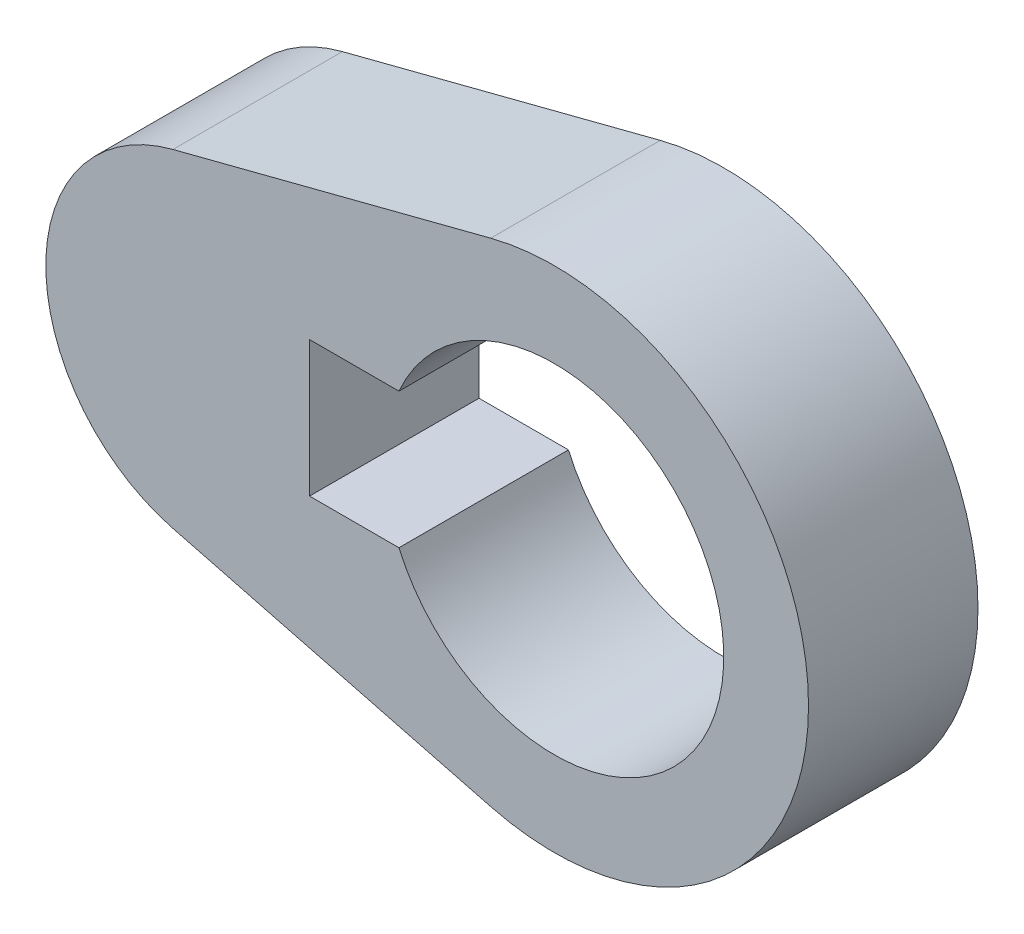
ISO-10303-21;
HEADER;
FILE_DESCRIPTION(('STEP AP214'),'2;1');
FILE_NAME('part.step','',(''),(''),'','','');
FILE_SCHEMA(('AUTOMOTIVE_DESIGN { 1 0 10303 214 1 1 1 1 }'));
ENDSEC;
DATA;
#1=APPLICATION_CONTEXT('core data for automotive mechanical design processes');
#2=APPLICATION_PROTOCOL_DEFINITION('international standard','automotive_design',2000,#1);
#3=PRODUCT_CONTEXT('',#1,'mechanical');
#4=PRODUCT('Part','Part','',(#3));
#5=PRODUCT_RELATED_PRODUCT_CATEGORY('part','',(#4));
#6=PRODUCT_DEFINITION_FORMATION('','',#4);
#7=PRODUCT_DEFINITION_CONTEXT('part definition',#1,'design');
#8=PRODUCT_DEFINITION('design','',#6,#7);
#9=PRODUCT_DEFINITION_SHAPE('','',#8);
#10=(LENGTH_UNIT() NAMED_UNIT(*) SI_UNIT(.MILLI.,.METRE.));
#11=(NAMED_UNIT(*) PLANE_ANGLE_UNIT() SI_UNIT($,.RADIAN.));
#12=(NAMED_UNIT(*) SI_UNIT($,.STERADIAN.) SOLID_ANGLE_UNIT());
#13=UNCERTAINTY_MEASURE_WITH_UNIT(LENGTH_MEASURE(1.E-05),#10,'distance_accuracy_value','');
#14=(GEOMETRIC_REPRESENTATION_CONTEXT(3) GLOBAL_UNCERTAINTY_ASSIGNED_CONTEXT((#13)) GLOBAL_UNIT_ASSIGNED_CONTEXT((#10,
#11,#12)) REPRESENTATION_CONTEXT('',''));
#15=CARTESIAN_POINT('',(0.,0.,0.));
#16=DIRECTION('',(0.,0.,1.));
#17=DIRECTION('',(1.,0.,0.));
#18=AXIS2_PLACEMENT_3D('',#15,#16,#17);
#19=CARTESIAN_POINT('',(0.,-2.,5.));
#20=DIRECTION('',(0.,-1.,0.));
#21=DIRECTION('',(0.,0.,-1.));
#22=AXIS2_PLACEMENT_3D('',#19,#20,#21);
#23=PLANE('',#22);
#24=DIRECTION('',(-1.,0.,0.));
#25=VECTOR('',#24,1.);
#26=CARTESIAN_POINT('',(0.,-2.,0.));
#27=LINE('',#26,#25);
#28=CARTESIAN_POINT('',(-12.0825756949558,-2.,0.));
#29=VERTEX_POINT('',#28);
#30=CARTESIAN_POINT('',(-14.72,-2.,0.));
#31=VERTEX_POINT('',#30);
#32=EDGE_CURVE('E172',#29,#31,#27,.T.);
#33=ORIENTED_EDGE('',*,*,#32,.T.);
#34=DIRECTION('',(0.,0.,-1.));
#35=VECTOR('',#34,1.);
#36=CARTESIAN_POINT('',(-14.72,-2.,5.));
#37=LINE('',#36,#35);
#38=CARTESIAN_POINT('',(-14.72,-2.,5.));
#39=VERTEX_POINT('',#38);
#40=EDGE_CURVE('E11',#39,#31,#37,.T.);
#41=ORIENTED_EDGE('',*,*,#40,.F.);
#42=DIRECTION('',(-1.,0.,0.));
#43=VECTOR('',#42,1.);
#44=CARTESIAN_POINT('',(0.,-2.,5.));
#45=LINE('',#44,#43);
#46=CARTESIAN_POINT('',(-12.0825756949558,-2.,5.));
#47=VERTEX_POINT('',#46);
#48=EDGE_CURVE('E137',#47,#39,#45,.T.);
#49=ORIENTED_EDGE('',*,*,#48,.F.);
#50=DIRECTION('',(0.,0.,-1.));
#51=VECTOR('',#50,1.);
#52=CARTESIAN_POINT('',(-12.0825756949558,-2.,5.));
#53=LINE('',#52,#51);
#54=EDGE_CURVE('E64',#47,#29,#53,.T.);
#55=ORIENTED_EDGE('',*,*,#54,.T.);
#56=EDGE_LOOP('',(#33,#41,#49,#55));
#57=FACE_BOUND('',#56,.T.);
#58=ADVANCED_FACE('F41',(#57),#23,.F.);
#59=CARTESIAN_POINT('',(-14.72,0.,5.));
#60=DIRECTION('',(-1.,0.,0.));
#61=DIRECTION('',(0.,0.,1.));
#62=AXIS2_PLACEMENT_3D('',#59,#60,#61);
#63=PLANE('',#62);
#64=DIRECTION('',(0.,1.,0.));
#65=VECTOR('',#64,1.);
#66=CARTESIAN_POINT('',(-14.72,0.,0.));
#67=LINE('',#66,#65);
#68=CARTESIAN_POINT('',(-14.72,2.,0.));
#69=VERTEX_POINT('',#68);
#70=EDGE_CURVE('E144',#31,#69,#67,.T.);
#71=ORIENTED_EDGE('',*,*,#70,.T.);
#72=DIRECTION('',(0.,0.,-1.));
#73=VECTOR('',#72,1.);
#74=CARTESIAN_POINT('',(-14.72,2.,5.));
#75=LINE('',#74,#73);
#76=CARTESIAN_POINT('',(-14.72,2.,5.));
#77=VERTEX_POINT('',#76);
#78=EDGE_CURVE('E52',#77,#69,#75,.T.);
#79=ORIENTED_EDGE('',*,*,#78,.F.);
#80=DIRECTION('',(0.,1.,0.));
#81=VECTOR('',#80,1.);
#82=CARTESIAN_POINT('',(-14.72,0.,5.));
#83=LINE('',#82,#81);
#84=EDGE_CURVE('E131',#39,#77,#83,.T.);
#85=ORIENTED_EDGE('',*,*,#84,.F.);
#86=ORIENTED_EDGE('',*,*,#40,.T.);
#87=EDGE_LOOP('',(#71,#79,#85,#86));
#88=FACE_BOUND('',#87,.T.);
#89=ADVANCED_FACE('F143',(#88),#63,.F.);
#90=CARTESIAN_POINT('',(0.,2.,5.));
#91=DIRECTION('',(0.,-1.,0.));
#92=DIRECTION('',(0.,0.,-1.));
#93=AXIS2_PLACEMENT_3D('',#90,#91,#92);
#94=PLANE('',#93);
#95=DIRECTION('',(-1.,0.,0.));
#96=VECTOR('',#95,1.);
#97=CARTESIAN_POINT('',(0.,2.,0.));
#98=LINE('',#97,#96);
#99=CARTESIAN_POINT('',(-12.0825756949558,2.,0.));
#100=VERTEX_POINT('',#99);
#101=EDGE_CURVE('E177',#100,#69,#98,.T.);
#102=ORIENTED_EDGE('',*,*,#101,.F.);
#103=DIRECTION('',(0.,0.,-1.));
#104=VECTOR('',#103,1.);
#105=CARTESIAN_POINT('',(-12.0825756949558,2.,5.));
#106=LINE('',#105,#104);
#107=CARTESIAN_POINT('',(-12.0825756949558,2.,5.));
#108=VERTEX_POINT('',#107);
#109=EDGE_CURVE('E97',#108,#100,#106,.T.);
#110=ORIENTED_EDGE('',*,*,#109,.F.);
#111=DIRECTION('',(-1.,0.,0.));
#112=VECTOR('',#111,1.);
#113=CARTESIAN_POINT('',(0.,2.,5.));
#114=LINE('',#113,#112);
#115=EDGE_CURVE('E136',#108,#77,#114,.T.);
#116=ORIENTED_EDGE('',*,*,#115,.T.);
#117=ORIENTED_EDGE('',*,*,#78,.T.);
#118=EDGE_LOOP('',(#102,#110,#116,#117));
#119=FACE_BOUND('',#118,.T.);
#120=ADVANCED_FACE('F149',(#119),#94,.T.);
#121=CARTESIAN_POINT('',(-2.34375,9.07730471767363,5.));
#122=DIRECTION('',(-0.25,0.968245836551854,0.));
#123=DIRECTION('',(-0.968245836551854,-0.25,0.));
#124=AXIS2_PLACEMENT_3D('',#121,#122,#123);
#125=PLANE('',#124);
#126=DIRECTION('',(0.968245836551854,0.25,0.));
#127=VECTOR('',#126,1.);
#128=CARTESIAN_POINT('',(-2.34375,9.07730471767363,0.));
#129=LINE('',#128,#127);
#130=CARTESIAN_POINT('',(-18.75,4.84122918275927,0.));
#131=VERTEX_POINT('',#130);
#132=CARTESIAN_POINT('',(-9.375,7.26184377413891,0.));
#133=VERTEX_POINT('',#132);
#134=EDGE_CURVE('E158',#131,#133,#129,.T.);
#135=ORIENTED_EDGE('',*,*,#134,.F.);
#136=DIRECTION('',(0.,0.,-1.));
#137=VECTOR('',#136,1.);
#138=CARTESIAN_POINT('',(-18.75,4.84122918275927,5.));
#139=LINE('',#138,#137);
#140=CARTESIAN_POINT('',(-18.75,4.84122918275927,5.));
#141=VERTEX_POINT('',#140);
#142=EDGE_CURVE('E45',#141,#131,#139,.T.);
#143=ORIENTED_EDGE('',*,*,#142,.F.);
#144=DIRECTION('',(0.968245836551854,0.25,0.));
#145=VECTOR('',#144,1.);
#146=CARTESIAN_POINT('',(-2.34375,9.07730471767363,5.));
#147=LINE('',#146,#145);
#148=CARTESIAN_POINT('',(-9.375,7.26184377413891,5.));
#149=VERTEX_POINT('',#148);
#150=EDGE_CURVE('E184',#141,#149,#147,.T.);
#151=ORIENTED_EDGE('',*,*,#150,.T.);
#152=DIRECTION('',(0.,0.,-1.));
#153=VECTOR('',#152,1.);
#154=CARTESIAN_POINT('',(-9.375,7.26184377413891,5.));
#155=LINE('',#154,#153);
#156=EDGE_CURVE('E154',#149,#133,#155,.T.);
#157=ORIENTED_EDGE('',*,*,#156,.T.);
#158=EDGE_LOOP('',(#135,#143,#151,#157));
#159=FACE_BOUND('',#158,.T.);
#160=ADVANCED_FACE('F43',(#159),#125,.T.);
#161=CARTESIAN_POINT('',(-17.5,0.,5.));
#162=DIRECTION('',(0.,0.,-1.));
#163=DIRECTION('',(-1.,0.,0.));
#164=AXIS2_PLACEMENT_3D('',#161,#162,#163);
#165=CYLINDRICAL_SURFACE('',#164,5.);
#166=CARTESIAN_POINT('',(-17.5,0.,0.));
#167=DIRECTION('',(0.,0.,1.));
#168=DIRECTION('',(1.,0.,0.));
#169=AXIS2_PLACEMENT_3D('',#166,#167,#168);
#170=CIRCLE('',#169,5.);
#171=CARTESIAN_POINT('',(-18.75,-4.84122918275927,0.));
#172=VERTEX_POINT('',#171);
#173=EDGE_CURVE('E162',#131,#172,#170,.T.);
#174=ORIENTED_EDGE('',*,*,#173,.T.);
#175=DIRECTION('',(0.,0.,-1.));
#176=VECTOR('',#175,1.);
#177=CARTESIAN_POINT('',(-18.75,-4.84122918275927,5.));
#178=LINE('',#177,#176);
#179=CARTESIAN_POINT('',(-18.75,-4.84122918275927,5.));
#180=VERTEX_POINT('',#179);
#181=EDGE_CURVE('E194',#180,#172,#178,.T.);
#182=ORIENTED_EDGE('',*,*,#181,.F.);
#183=CARTESIAN_POINT('',(-17.5,0.,5.));
#184=DIRECTION('',(0.,0.,1.));
#185=DIRECTION('',(1.,0.,0.));
#186=AXIS2_PLACEMENT_3D('',#183,#184,#185);
#187=CIRCLE('',#186,5.);
#188=EDGE_CURVE('E206',#141,#180,#187,.T.);
#189=ORIENTED_EDGE('',*,*,#188,.F.);
#190=ORIENTED_EDGE('',*,*,#142,.T.);
#191=EDGE_LOOP('',(#174,#182,#189,#190));
#192=FACE_BOUND('',#191,.T.);
#193=ADVANCED_FACE('F205',(#192),#165,.T.);
#194=CARTESIAN_POINT('',(-2.34375000000001,-9.07730471767364,5.));
#195=DIRECTION('',(0.25,0.968245836551854,0.));
#196=DIRECTION('',(-0.968245836551854,0.25,0.));
#197=AXIS2_PLACEMENT_3D('',#194,#195,#196);
#198=PLANE('',#197);
#199=DIRECTION('',(0.968245836551854,-0.25,0.));
#200=VECTOR('',#199,1.);
#201=CARTESIAN_POINT('',(-2.34375000000001,-9.07730471767364,0.));
#202=LINE('',#201,#200);
#203=CARTESIAN_POINT('',(-9.375,-7.26184377413891,0.));
#204=VERTEX_POINT('',#203);
#205=EDGE_CURVE('E165',#172,#204,#202,.T.);
#206=ORIENTED_EDGE('',*,*,#205,.T.);
#207=DIRECTION('',(0.,0.,-1.));
#208=VECTOR('',#207,1.);
#209=CARTESIAN_POINT('',(-9.375,-7.26184377413891,5.));
#210=LINE('',#209,#208);
#211=CARTESIAN_POINT('',(-9.375,-7.26184377413891,5.));
#212=VERTEX_POINT('',#211);
#213=EDGE_CURVE('E191',#212,#204,#210,.T.);
#214=ORIENTED_EDGE('',*,*,#213,.F.);
#215=DIRECTION('',(0.968245836551854,-0.25,0.));
#216=VECTOR('',#215,1.);
#217=CARTESIAN_POINT('',(-2.34375000000001,-9.07730471767364,5.));
#218=LINE('',#217,#216);
#219=EDGE_CURVE('E219',#180,#212,#218,.T.);
#220=ORIENTED_EDGE('',*,*,#219,.F.);
#221=ORIENTED_EDGE('',*,*,#181,.T.);
#222=EDGE_LOOP('',(#206,#214,#220,#221));
#223=FACE_BOUND('',#222,.T.);
#224=ADVANCED_FACE('F218',(#223),#198,.F.);
#225=CARTESIAN_POINT('',(-7.5,0.,5.));
#226=DIRECTION('',(0.,0.,-1.));
#227=DIRECTION('',(-1.,0.,0.));
#228=AXIS2_PLACEMENT_3D('',#225,#226,#227);
#229=CYLINDRICAL_SURFACE('',#228,7.5);
#230=CARTESIAN_POINT('',(-7.5,0.,0.));
#231=DIRECTION('',(0.,0.,1.));
#232=DIRECTION('',(1.,0.,0.));
#233=AXIS2_PLACEMENT_3D('',#230,#231,#232);
#234=CIRCLE('',#233,7.5);
#235=EDGE_CURVE('E168',#204,#133,#234,.T.);
#236=ORIENTED_EDGE('',*,*,#235,.T.);
#237=ORIENTED_EDGE('',*,*,#156,.F.);
#238=CARTESIAN_POINT('',(-7.5,0.,5.));
#239=DIRECTION('',(0.,0.,1.));
#240=DIRECTION('',(1.,0.,0.));
#241=AXIS2_PLACEMENT_3D('',#238,#239,#240);
#242=CIRCLE('',#241,7.5);
#243=EDGE_CURVE('E217',#212,#149,#242,.T.);
#244=ORIENTED_EDGE('',*,*,#243,.F.);
#245=ORIENTED_EDGE('',*,*,#213,.T.);
#246=EDGE_LOOP('',(#236,#237,#244,#245));
#247=FACE_BOUND('',#246,.T.);
#248=ADVANCED_FACE('F215',(#247),#229,.T.);
#249=CARTESIAN_POINT('',(-7.5,0.,5.));
#250=DIRECTION('',(0.,0.,-1.));
#251=DIRECTION('',(-1.,0.,0.));
#252=AXIS2_PLACEMENT_3D('',#249,#250,#251);
#253=CYLINDRICAL_SURFACE('',#252,5.);
#254=CARTESIAN_POINT('',(-7.5,0.,0.));
#255=DIRECTION('',(0.,0.,1.));
#256=DIRECTION('',(1.,0.,0.));
#257=AXIS2_PLACEMENT_3D('',#254,#255,#256);
#258=CIRCLE('',#257,5.);
#259=EDGE_CURVE('E180',#29,#100,#258,.T.);
#260=ORIENTED_EDGE('',*,*,#259,.F.);
#261=ORIENTED_EDGE('',*,*,#54,.F.);
#262=CARTESIAN_POINT('',(-7.5,0.,5.));
#263=DIRECTION('',(0.,0.,1.));
#264=DIRECTION('',(1.,0.,0.));
#265=AXIS2_PLACEMENT_3D('',#262,#263,#264);
#266=CIRCLE('',#265,5.);
#267=EDGE_CURVE('E151',#47,#108,#266,.T.);
#268=ORIENTED_EDGE('',*,*,#267,.T.);
#269=ORIENTED_EDGE('',*,*,#109,.T.);
#270=EDGE_LOOP('',(#260,#261,#268,#269));
#271=FACE_BOUND('',#270,.T.);
#272=ADVANCED_FACE('F230',(#271),#253,.F.);
#273=CARTESIAN_POINT('',(0.,0.,5.));
#274=DIRECTION('',(0.,0.,1.));
#275=DIRECTION('',(1.,0.,0.));
#276=AXIS2_PLACEMENT_3D('',#273,#274,#275);
#277=PLANE('',#276);
#278=ORIENTED_EDGE('',*,*,#150,.F.);
#279=ORIENTED_EDGE('',*,*,#188,.T.);
#280=ORIENTED_EDGE('',*,*,#219,.T.);
#281=ORIENTED_EDGE('',*,*,#243,.T.);
#282=EDGE_LOOP('',(#278,#279,#280,#281));
#283=FACE_BOUND('',#282,.T.);
#284=ORIENTED_EDGE('',*,*,#48,.T.);
#285=ORIENTED_EDGE('',*,*,#84,.T.);
#286=ORIENTED_EDGE('',*,*,#115,.F.);
#287=ORIENTED_EDGE('',*,*,#267,.F.);
#288=EDGE_LOOP('',(#284,#285,#286,#287));
#289=FACE_BOUND('',#288,.T.);
#290=ADVANCED_FACE('F133',(#283,#289),#277,.T.);
#291=CARTESIAN_POINT('',(0.,0.,0.));
#292=DIRECTION('',(0.,0.,1.));
#293=DIRECTION('',(1.,0.,0.));
#294=AXIS2_PLACEMENT_3D('',#291,#292,#293);
#295=PLANE('',#294);
#296=ORIENTED_EDGE('',*,*,#134,.T.);
#297=ORIENTED_EDGE('',*,*,#235,.F.);
#298=ORIENTED_EDGE('',*,*,#205,.F.);
#299=ORIENTED_EDGE('',*,*,#173,.F.);
#300=EDGE_LOOP('',(#296,#297,#298,#299));
#301=FACE_BOUND('',#300,.T.);
#302=ORIENTED_EDGE('',*,*,#32,.F.);
#303=ORIENTED_EDGE('',*,*,#259,.T.);
#304=ORIENTED_EDGE('',*,*,#101,.T.);
#305=ORIENTED_EDGE('',*,*,#70,.F.);
#306=EDGE_LOOP('',(#302,#303,#304,#305));
#307=FACE_BOUND('',#306,.T.);
#308=ADVANCED_FACE('F209',(#301,#307),#295,.F.);
#309=CLOSED_SHELL('',(#58,#89,#120,#160,#193,#224,#248,#272,#290,#308));
#310=MANIFOLD_SOLID_BREP('B2',#309);
#311=ADVANCED_BREP_SHAPE_REPRESENTATION('',(#18,#310),#14);
#312=SHAPE_DEFINITION_REPRESENTATION(#9,#311);
ENDSEC;
END-ISO-10303-21;
